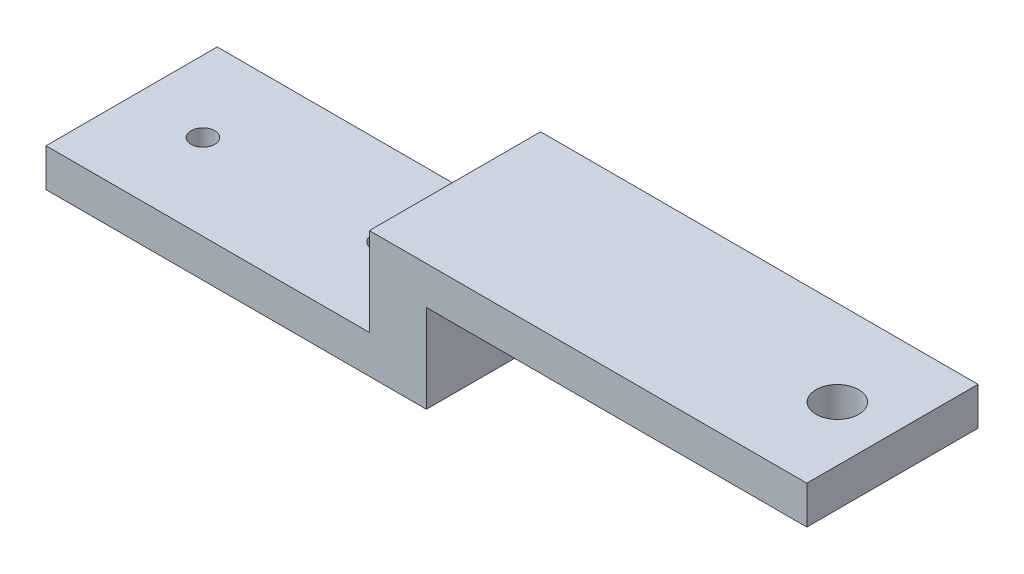
ISO-10303-21;
HEADER;
FILE_DESCRIPTION(('STEP AP214'),'2;1');
FILE_NAME('part.step','',(''),(''),'','','');
FILE_SCHEMA(('AUTOMOTIVE_DESIGN { 1 0 10303 214 1 1 1 1 }'));
ENDSEC;
DATA;
#1=APPLICATION_CONTEXT('core data for automotive mechanical design processes');
#2=APPLICATION_PROTOCOL_DEFINITION('international standard','automotive_design',2000,#1);
#3=PRODUCT_CONTEXT('',#1,'mechanical');
#4=PRODUCT('Part','Part','',(#3));
#5=PRODUCT_RELATED_PRODUCT_CATEGORY('part','',(#4));
#6=PRODUCT_DEFINITION_FORMATION('','',#4);
#7=PRODUCT_DEFINITION_CONTEXT('part definition',#1,'design');
#8=PRODUCT_DEFINITION('design','',#6,#7);
#9=PRODUCT_DEFINITION_SHAPE('','',#8);
#10=(LENGTH_UNIT() NAMED_UNIT(*) SI_UNIT(.MILLI.,.METRE.));
#11=(NAMED_UNIT(*) PLANE_ANGLE_UNIT() SI_UNIT($,.RADIAN.));
#12=(NAMED_UNIT(*) SI_UNIT($,.STERADIAN.) SOLID_ANGLE_UNIT());
#13=UNCERTAINTY_MEASURE_WITH_UNIT(LENGTH_MEASURE(1.E-05),#10,'distance_accuracy_value','');
#14=(GEOMETRIC_REPRESENTATION_CONTEXT(3) GLOBAL_UNCERTAINTY_ASSIGNED_CONTEXT((#13)) GLOBAL_UNIT_ASSIGNED_CONTEXT((#10,
#11,#12)) REPRESENTATION_CONTEXT('',''));
#15=CARTESIAN_POINT('',(0.,0.,0.));
#16=DIRECTION('',(0.,0.,1.));
#17=DIRECTION('',(1.,0.,0.));
#18=AXIS2_PLACEMENT_3D('',#15,#16,#17);
#19=CARTESIAN_POINT('',(-123.814545152344,-18.5467840389636,36.));
#20=DIRECTION('',(1.,0.,0.));
#21=DIRECTION('',(0.,0.,-1.));
#22=AXIS2_PLACEMENT_3D('',#19,#20,#21);
#23=PLANE('',#22);
#24=DIRECTION('',(0.,-1.,0.));
#25=VECTOR('',#24,1.);
#26=CARTESIAN_POINT('',(-123.814545152344,-18.5467840389636,0.));
#27=LINE('',#26,#25);
#28=CARTESIAN_POINT('',(-123.814545152344,-18.5467840389636,0.));
#29=VERTEX_POINT('',#28);
#30=CARTESIAN_POINT('',(-123.814545152344,-26.5467840389636,0.));
#31=VERTEX_POINT('',#30);
#32=EDGE_CURVE('E139',#29,#31,#27,.T.);
#33=ORIENTED_EDGE('',*,*,#32,.T.);
#34=DIRECTION('',(0.,0.,-1.));
#35=VECTOR('',#34,1.);
#36=CARTESIAN_POINT('',(-123.814545152344,-26.5467840389636,36.));
#37=LINE('',#36,#35);
#38=CARTESIAN_POINT('',(-123.814545152344,-26.5467840389636,36.));
#39=VERTEX_POINT('',#38);
#40=EDGE_CURVE('E11',#39,#31,#37,.T.);
#41=ORIENTED_EDGE('',*,*,#40,.F.);
#42=DIRECTION('',(0.,-1.,0.));
#43=VECTOR('',#42,1.);
#44=CARTESIAN_POINT('',(-123.814545152344,-18.5467840389636,36.));
#45=LINE('',#44,#43);
#46=CARTESIAN_POINT('',(-123.814545152344,-18.5467840389636,36.));
#47=VERTEX_POINT('',#46);
#48=EDGE_CURVE('E165',#47,#39,#45,.T.);
#49=ORIENTED_EDGE('',*,*,#48,.F.);
#50=DIRECTION('',(0.,0.,-1.));
#51=VECTOR('',#50,1.);
#52=CARTESIAN_POINT('',(-123.814545152344,-18.5467840389636,36.));
#53=LINE('',#52,#51);
#54=EDGE_CURVE('E135',#47,#29,#53,.T.);
#55=ORIENTED_EDGE('',*,*,#54,.T.);
#56=EDGE_LOOP('',(#33,#41,#49,#55));
#57=FACE_BOUND('',#56,.T.);
#58=ADVANCED_FACE('F39',(#57),#23,.F.);
#59=CARTESIAN_POINT('',(-123.814545152344,-26.5467840389636,36.));
#60=DIRECTION('',(0.,1.,0.));
#61=DIRECTION('',(0.,0.,1.));
#62=AXIS2_PLACEMENT_3D('',#59,#60,#61);
#63=PLANE('',#62);
#64=CARTESIAN_POINT('',(-108.814545152344,-26.5467840389636,18.));
#65=DIRECTION('',(0.,1.,0.));
#66=DIRECTION('',(0.,0.,1.));
#67=AXIS2_PLACEMENT_3D('',#64,#65,#66);
#68=CIRCLE('',#67,2.50000000000001);
#69=CARTESIAN_POINT('',(-108.814545152344,-26.5467840389636,20.5));
#70=VERTEX_POINT('',#69);
#71=EDGE_CURVE('E216',#70,#70,#68,.T.);
#72=ORIENTED_EDGE('',*,*,#71,.T.);
#73=EDGE_LOOP('',(#72));
#74=FACE_BOUND('',#73,.T.);
#75=CARTESIAN_POINT('',(-70.8145451523444,-26.5467840389636,18.));
#76=DIRECTION('',(0.,1.,0.));
#77=DIRECTION('',(0.,0.,1.));
#78=AXIS2_PLACEMENT_3D('',#75,#76,#77);
#79=CIRCLE('',#78,2.50000000000001);
#80=CARTESIAN_POINT('',(-70.8145451523444,-26.5467840389636,20.5));
#81=VERTEX_POINT('',#80);
#82=EDGE_CURVE('E220',#81,#81,#79,.T.);
#83=ORIENTED_EDGE('',*,*,#82,.T.);
#84=EDGE_LOOP('',(#83));
#85=FACE_BOUND('',#84,.T.);
#86=DIRECTION('',(1.,0.,0.));
#87=VECTOR('',#86,1.);
#88=CARTESIAN_POINT('',(-123.814545152344,-26.5467840389636,0.));
#89=LINE('',#88,#87);
#90=CARTESIAN_POINT('',(-43.8145451523444,-26.5467840389636,0.));
#91=VERTEX_POINT('',#90);
#92=EDGE_CURVE('E143',#31,#91,#89,.T.);
#93=ORIENTED_EDGE('',*,*,#92,.T.);
#94=DIRECTION('',(0.,0.,-1.));
#95=VECTOR('',#94,1.);
#96=CARTESIAN_POINT('',(-43.8145451523444,-26.5467840389636,36.));
#97=LINE('',#96,#95);
#98=CARTESIAN_POINT('',(-43.8145451523444,-26.5467840389636,36.));
#99=VERTEX_POINT('',#98);
#100=EDGE_CURVE('E48',#99,#91,#97,.T.);
#101=ORIENTED_EDGE('',*,*,#100,.F.);
#102=DIRECTION('',(1.,0.,0.));
#103=VECTOR('',#102,1.);
#104=CARTESIAN_POINT('',(-123.814545152344,-26.5467840389636,36.));
#105=LINE('',#104,#103);
#106=EDGE_CURVE('E99',#39,#99,#105,.T.);
#107=ORIENTED_EDGE('',*,*,#106,.F.);
#108=ORIENTED_EDGE('',*,*,#40,.T.);
#109=EDGE_LOOP('',(#93,#101,#107,#108));
#110=FACE_BOUND('',#109,.T.);
#111=ADVANCED_FACE('F186',(#74,#85,#110),#63,.F.);
#112=CARTESIAN_POINT('',(-43.8145451523444,-15.6889196626947,36.));
#113=DIRECTION('',(-1.,0.,0.));
#114=DIRECTION('',(0.,0.,1.));
#115=AXIS2_PLACEMENT_3D('',#112,#113,#114);
#116=PLANE('',#115);
#117=DIRECTION('',(0.,1.,0.));
#118=VECTOR('',#117,1.);
#119=CARTESIAN_POINT('',(-43.8145451523444,-15.6889196626947,0.));
#120=LINE('',#119,#118);
#121=CARTESIAN_POINT('',(-43.8145451523444,-8.00000000000001,0.));
#122=VERTEX_POINT('',#121);
#123=EDGE_CURVE('E148',#91,#122,#120,.T.);
#124=ORIENTED_EDGE('',*,*,#123,.T.);
#125=DIRECTION('',(0.,0.,-1.));
#126=VECTOR('',#125,1.);
#127=CARTESIAN_POINT('',(-43.8145451523444,-8.00000000000001,36.));
#128=LINE('',#127,#126);
#129=CARTESIAN_POINT('',(-43.8145451523444,-8.00000000000001,36.));
#130=VERTEX_POINT('',#129);
#131=EDGE_CURVE('E176',#130,#122,#128,.T.);
#132=ORIENTED_EDGE('',*,*,#131,.F.);
#133=DIRECTION('',(0.,1.,0.));
#134=VECTOR('',#133,1.);
#135=CARTESIAN_POINT('',(-43.8145451523444,-26.5467840389636,36.));
#136=LINE('',#135,#134);
#137=EDGE_CURVE('E185',#99,#130,#136,.T.);
#138=ORIENTED_EDGE('',*,*,#137,.F.);
#139=ORIENTED_EDGE('',*,*,#100,.T.);
#140=EDGE_LOOP('',(#124,#132,#138,#139));
#141=FACE_BOUND('',#140,.T.);
#142=ADVANCED_FACE('F183',(#141),#116,.F.);
#143=CARTESIAN_POINT('',(0.496524766701516,-8.00000000000001,36.));
#144=DIRECTION('',(0.,1.,0.));
#145=DIRECTION('',(-1.,0.,0.));
#146=AXIS2_PLACEMENT_3D('',#143,#144,#145);
#147=PLANE('',#146);
#148=CARTESIAN_POINT('',(24.6113999571899,-8.00000000000001,18.));
#149=DIRECTION('',(0.,1.,0.));
#150=DIRECTION('',(-1.,0.,0.));
#151=AXIS2_PLACEMENT_3D('',#148,#149,#150);
#152=CIRCLE('',#151,4.5);
#153=CARTESIAN_POINT('',(20.1113999571899,-8.00000000000001,18.));
#154=VERTEX_POINT('',#153);
#155=EDGE_CURVE('E144',#154,#154,#152,.T.);
#156=ORIENTED_EDGE('',*,*,#155,.T.);
#157=EDGE_LOOP('',(#156));
#158=FACE_BOUND('',#157,.T.);
#159=DIRECTION('',(1.,0.,0.));
#160=VECTOR('',#159,1.);
#161=CARTESIAN_POINT('',(0.496524766701516,-8.00000000000001,0.));
#162=LINE('',#161,#160);
#163=CARTESIAN_POINT('',(36.1854548476556,-8.00000000000001,0.));
#164=VERTEX_POINT('',#163);
#165=EDGE_CURVE('E152',#122,#164,#162,.T.);
#166=ORIENTED_EDGE('',*,*,#165,.T.);
#167=DIRECTION('',(0.,0.,-1.));
#168=VECTOR('',#167,1.);
#169=CARTESIAN_POINT('',(36.1854548476556,-8.00000000000001,36.));
#170=LINE('',#169,#168);
#171=CARTESIAN_POINT('',(36.1854548476556,-8.00000000000001,36.));
#172=VERTEX_POINT('',#171);
#173=EDGE_CURVE('E172',#172,#164,#170,.T.);
#174=ORIENTED_EDGE('',*,*,#173,.F.);
#175=DIRECTION('',(1.,0.,0.));
#176=VECTOR('',#175,1.);
#177=CARTESIAN_POINT('',(-43.8145451523444,-8.00000000000001,36.));
#178=LINE('',#177,#176);
#179=EDGE_CURVE('E199',#130,#172,#178,.T.);
#180=ORIENTED_EDGE('',*,*,#179,.F.);
#181=ORIENTED_EDGE('',*,*,#131,.T.);
#182=EDGE_LOOP('',(#166,#174,#180,#181));
#183=FACE_BOUND('',#182,.T.);
#184=ADVANCED_FACE('F194',(#158,#183),#147,.F.);
#185=CARTESIAN_POINT('',(36.1854548476556,-8.00000000000001,36.));
#186=DIRECTION('',(-1.,0.,0.));
#187=DIRECTION('',(0.,0.,1.));
#188=AXIS2_PLACEMENT_3D('',#185,#186,#187);
#189=PLANE('',#188);
#190=DIRECTION('',(0.,1.,0.));
#191=VECTOR('',#190,1.);
#192=CARTESIAN_POINT('',(36.1854548476556,-8.00000000000001,0.));
#193=LINE('',#192,#191);
#194=CARTESIAN_POINT('',(36.1854548476556,0.,0.));
#195=VERTEX_POINT('',#194);
#196=EDGE_CURVE('E155',#164,#195,#193,.T.);
#197=ORIENTED_EDGE('',*,*,#196,.T.);
#198=DIRECTION('',(0.,0.,-1.));
#199=VECTOR('',#198,1.);
#200=CARTESIAN_POINT('',(36.1854548476556,0.,36.));
#201=LINE('',#200,#199);
#202=CARTESIAN_POINT('',(36.1854548476556,0.,36.));
#203=VERTEX_POINT('',#202);
#204=EDGE_CURVE('E128',#203,#195,#201,.T.);
#205=ORIENTED_EDGE('',*,*,#204,.F.);
#206=DIRECTION('',(0.,1.,0.));
#207=VECTOR('',#206,1.);
#208=CARTESIAN_POINT('',(36.1854548476556,-8.00000000000001,36.));
#209=LINE('',#208,#207);
#210=EDGE_CURVE('E118',#172,#203,#209,.T.);
#211=ORIENTED_EDGE('',*,*,#210,.F.);
#212=ORIENTED_EDGE('',*,*,#173,.T.);
#213=EDGE_LOOP('',(#197,#205,#211,#212));
#214=FACE_BOUND('',#213,.T.);
#215=ADVANCED_FACE('F197',(#214),#189,.F.);
#216=CARTESIAN_POINT('',(-55.8145451523444,0.,36.));
#217=DIRECTION('',(0.,-1.,0.));
#218=DIRECTION('',(1.,0.,0.));
#219=AXIS2_PLACEMENT_3D('',#216,#217,#218);
#220=PLANE('',#219);
#221=CARTESIAN_POINT('',(24.6113999571899,0.,18.));
#222=DIRECTION('',(0.,1.,0.));
#223=DIRECTION('',(-1.,0.,0.));
#224=AXIS2_PLACEMENT_3D('',#221,#222,#223);
#225=CIRCLE('',#224,4.5);
#226=CARTESIAN_POINT('',(20.1113999571899,0.,18.));
#227=VERTEX_POINT('',#226);
#228=EDGE_CURVE('E212',#227,#227,#225,.T.);
#229=ORIENTED_EDGE('',*,*,#228,.F.);
#230=EDGE_LOOP('',(#229));
#231=FACE_BOUND('',#230,.T.);
#232=DIRECTION('',(-1.,0.,0.));
#233=VECTOR('',#232,1.);
#234=CARTESIAN_POINT('',(-55.8145451523444,0.,0.));
#235=LINE('',#234,#233);
#236=CARTESIAN_POINT('',(-55.8145451523444,0.,0.));
#237=VERTEX_POINT('',#236);
#238=EDGE_CURVE('E126',#195,#237,#235,.T.);
#239=ORIENTED_EDGE('',*,*,#238,.T.);
#240=DIRECTION('',(0.,0.,-1.));
#241=VECTOR('',#240,1.);
#242=CARTESIAN_POINT('',(-55.8145451523444,0.,36.));
#243=LINE('',#242,#241);
#244=CARTESIAN_POINT('',(-55.8145451523444,0.,36.));
#245=VERTEX_POINT('',#244);
#246=EDGE_CURVE('E124',#245,#237,#243,.T.);
#247=ORIENTED_EDGE('',*,*,#246,.F.);
#248=DIRECTION('',(-1.,0.,0.));
#249=VECTOR('',#248,1.);
#250=CARTESIAN_POINT('',(36.1854548476556,0.,36.));
#251=LINE('',#250,#249);
#252=EDGE_CURVE('E112',#203,#245,#251,.T.);
#253=ORIENTED_EDGE('',*,*,#252,.F.);
#254=ORIENTED_EDGE('',*,*,#204,.T.);
#255=EDGE_LOOP('',(#239,#247,#253,#254));
#256=FACE_BOUND('',#255,.T.);
#257=ADVANCED_FACE('F125',(#231,#256),#220,.F.);
#258=CARTESIAN_POINT('',(-55.8145451523444,0.,36.));
#259=DIRECTION('',(1.,0.,0.));
#260=DIRECTION('',(0.,0.,-1.));
#261=AXIS2_PLACEMENT_3D('',#258,#259,#260);
#262=PLANE('',#261);
#263=DIRECTION('',(0.,-1.,0.));
#264=VECTOR('',#263,1.);
#265=CARTESIAN_POINT('',(-55.8145451523444,0.,0.));
#266=LINE('',#265,#264);
#267=CARTESIAN_POINT('',(-55.8145451523444,-18.5467840389636,0.));
#268=VERTEX_POINT('',#267);
#269=EDGE_CURVE('E85',#237,#268,#266,.T.);
#270=ORIENTED_EDGE('',*,*,#269,.T.);
#271=DIRECTION('',(0.,0.,-1.));
#272=VECTOR('',#271,1.);
#273=CARTESIAN_POINT('',(-55.8145451523444,-18.5467840389636,36.));
#274=LINE('',#273,#272);
#275=CARTESIAN_POINT('',(-55.8145451523444,-18.5467840389636,36.));
#276=VERTEX_POINT('',#275);
#277=EDGE_CURVE('E129',#276,#268,#274,.T.);
#278=ORIENTED_EDGE('',*,*,#277,.F.);
#279=DIRECTION('',(0.,-1.,0.));
#280=VECTOR('',#279,1.);
#281=CARTESIAN_POINT('',(-55.8145451523444,0.,36.));
#282=LINE('',#281,#280);
#283=EDGE_CURVE('E116',#245,#276,#282,.T.);
#284=ORIENTED_EDGE('',*,*,#283,.F.);
#285=ORIENTED_EDGE('',*,*,#246,.T.);
#286=EDGE_LOOP('',(#270,#278,#284,#285));
#287=FACE_BOUND('',#286,.T.);
#288=ADVANCED_FACE('F131',(#287),#262,.F.);
#289=CARTESIAN_POINT('',(-123.814545152344,-18.5467840389636,36.));
#290=DIRECTION('',(0.,-1.,0.));
#291=DIRECTION('',(0.,0.,-1.));
#292=AXIS2_PLACEMENT_3D('',#289,#290,#291);
#293=PLANE('',#292);
#294=CARTESIAN_POINT('',(-108.814545152344,-18.5467840389636,18.));
#295=DIRECTION('',(0.,1.,0.));
#296=DIRECTION('',(0.,0.,1.));
#297=AXIS2_PLACEMENT_3D('',#294,#295,#296);
#298=CIRCLE('',#297,2.50000000000001);
#299=CARTESIAN_POINT('',(-108.814545152344,-18.5467840389636,20.5));
#300=VERTEX_POINT('',#299);
#301=EDGE_CURVE('E224',#300,#300,#298,.T.);
#302=ORIENTED_EDGE('',*,*,#301,.F.);
#303=EDGE_LOOP('',(#302));
#304=FACE_BOUND('',#303,.T.);
#305=CARTESIAN_POINT('',(-70.8145451523444,-18.5467840389636,18.));
#306=DIRECTION('',(0.,1.,0.));
#307=DIRECTION('',(0.,0.,1.));
#308=AXIS2_PLACEMENT_3D('',#305,#306,#307);
#309=CIRCLE('',#308,2.50000000000001);
#310=CARTESIAN_POINT('',(-70.8145451523444,-18.5467840389636,20.5));
#311=VERTEX_POINT('',#310);
#312=EDGE_CURVE('E225',#311,#311,#309,.T.);
#313=ORIENTED_EDGE('',*,*,#312,.F.);
#314=EDGE_LOOP('',(#313));
#315=FACE_BOUND('',#314,.T.);
#316=DIRECTION('',(-1.,0.,0.));
#317=VECTOR('',#316,1.);
#318=CARTESIAN_POINT('',(-123.814545152344,-18.5467840389636,0.));
#319=LINE('',#318,#317);
#320=EDGE_CURVE('E91',#268,#29,#319,.T.);
#321=ORIENTED_EDGE('',*,*,#320,.T.);
#322=ORIENTED_EDGE('',*,*,#54,.F.);
#323=DIRECTION('',(-1.,0.,0.));
#324=VECTOR('',#323,1.);
#325=CARTESIAN_POINT('',(-123.814545152344,-18.5467840389636,36.));
#326=LINE('',#325,#324);
#327=EDGE_CURVE('E56',#276,#47,#326,.T.);
#328=ORIENTED_EDGE('',*,*,#327,.F.);
#329=ORIENTED_EDGE('',*,*,#277,.T.);
#330=EDGE_LOOP('',(#321,#322,#328,#329));
#331=FACE_BOUND('',#330,.T.);
#332=ADVANCED_FACE('F236',(#304,#315,#331),#293,.F.);
#333=CARTESIAN_POINT('',(0.,0.,36.));
#334=DIRECTION('',(0.,0.,1.));
#335=DIRECTION('',(1.,0.,0.));
#336=AXIS2_PLACEMENT_3D('',#333,#334,#335);
#337=PLANE('',#336);
#338=ORIENTED_EDGE('',*,*,#48,.T.);
#339=ORIENTED_EDGE('',*,*,#106,.T.);
#340=ORIENTED_EDGE('',*,*,#137,.T.);
#341=ORIENTED_EDGE('',*,*,#179,.T.);
#342=ORIENTED_EDGE('',*,*,#210,.T.);
#343=ORIENTED_EDGE('',*,*,#252,.T.);
#344=ORIENTED_EDGE('',*,*,#283,.T.);
#345=ORIENTED_EDGE('',*,*,#327,.T.);
#346=EDGE_LOOP('',(#338,#339,#340,#341,#342,#343,#344,#345));
#347=FACE_BOUND('',#346,.T.);
#348=ADVANCED_FACE('F114',(#347),#337,.T.);
#349=CARTESIAN_POINT('',(0.,0.,0.));
#350=DIRECTION('',(0.,0.,1.));
#351=DIRECTION('',(1.,0.,0.));
#352=AXIS2_PLACEMENT_3D('',#349,#350,#351);
#353=PLANE('',#352);
#354=ORIENTED_EDGE('',*,*,#32,.F.);
#355=ORIENTED_EDGE('',*,*,#320,.F.);
#356=ORIENTED_EDGE('',*,*,#269,.F.);
#357=ORIENTED_EDGE('',*,*,#238,.F.);
#358=ORIENTED_EDGE('',*,*,#196,.F.);
#359=ORIENTED_EDGE('',*,*,#165,.F.);
#360=ORIENTED_EDGE('',*,*,#123,.F.);
#361=ORIENTED_EDGE('',*,*,#92,.F.);
#362=EDGE_LOOP('',(#354,#355,#356,#357,#358,#359,#360,#361));
#363=FACE_BOUND('',#362,.T.);
#364=ADVANCED_FACE('F190',(#363),#353,.F.);
#365=CARTESIAN_POINT('',(24.6113999571899,-30.,18.));
#366=DIRECTION('',(0.,1.,0.));
#367=DIRECTION('',(-1.,0.,0.));
#368=AXIS2_PLACEMENT_3D('',#365,#366,#367);
#369=CYLINDRICAL_SURFACE('',#368,4.5);
#370=ORIENTED_EDGE('',*,*,#228,.T.);
#371=EDGE_LOOP('',(#370));
#372=FACE_BOUND('',#371,.T.);
#373=ORIENTED_EDGE('',*,*,#155,.F.);
#374=EDGE_LOOP('',(#373));
#375=FACE_BOUND('',#374,.T.);
#376=ADVANCED_FACE('F245',(#372,#375),#369,.F.);
#377=CARTESIAN_POINT('',(-70.8145451523444,-28.5467840389636,18.));
#378=DIRECTION('',(0.,1.,0.));
#379=DIRECTION('',(0.,0.,1.));
#380=AXIS2_PLACEMENT_3D('',#377,#378,#379);
#381=CYLINDRICAL_SURFACE('',#380,2.50000000000001);
#382=ORIENTED_EDGE('',*,*,#312,.T.);
#383=EDGE_LOOP('',(#382));
#384=FACE_BOUND('',#383,.T.);
#385=ORIENTED_EDGE('',*,*,#82,.F.);
#386=EDGE_LOOP('',(#385));
#387=FACE_BOUND('',#386,.T.);
#388=ADVANCED_FACE('F242',(#384,#387),#381,.F.);
#389=CARTESIAN_POINT('',(-108.814545152344,-28.5467840389636,18.));
#390=DIRECTION('',(0.,1.,0.));
#391=DIRECTION('',(0.,0.,1.));
#392=AXIS2_PLACEMENT_3D('',#389,#390,#391);
#393=CYLINDRICAL_SURFACE('',#392,2.50000000000001);
#394=ORIENTED_EDGE('',*,*,#301,.T.);
#395=EDGE_LOOP('',(#394));
#396=FACE_BOUND('',#395,.T.);
#397=ORIENTED_EDGE('',*,*,#71,.F.);
#398=EDGE_LOOP('',(#397));
#399=FACE_BOUND('',#398,.T.);
#400=ADVANCED_FACE('F233',(#396,#399),#393,.F.);
#401=CLOSED_SHELL('',(#58,#111,#142,#184,#215,#257,#288,#332,#348,#364,#376,#388,#400));
#402=MANIFOLD_SOLID_BREP('B2',#401);
#403=ADVANCED_BREP_SHAPE_REPRESENTATION('',(#18,#402),#14);
#404=SHAPE_DEFINITION_REPRESENTATION(#9,#403);
ENDSEC;
END-ISO-10303-21;
